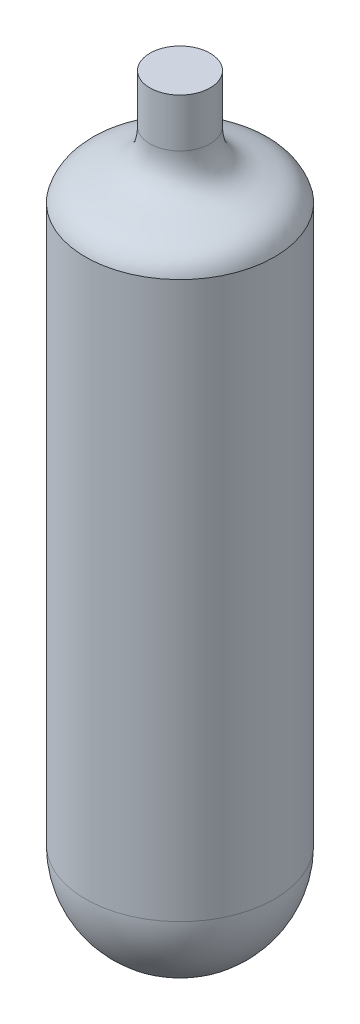
ISO-10303-21;
HEADER;
FILE_DESCRIPTION(('STEP AP214'),'2;1');
FILE_NAME('part.step','',(''),(''),'','','');
FILE_SCHEMA(('AUTOMOTIVE_DESIGN { 1 0 10303 214 1 1 1 1 }'));
ENDSEC;
DATA;
#1=APPLICATION_CONTEXT('core data for automotive mechanical design processes');
#2=APPLICATION_PROTOCOL_DEFINITION('international standard','automotive_design',2000,#1);
#3=PRODUCT_CONTEXT('',#1,'mechanical');
#4=PRODUCT('Part','Part','',(#3));
#5=PRODUCT_RELATED_PRODUCT_CATEGORY('part','',(#4));
#6=PRODUCT_DEFINITION_FORMATION('','',#4);
#7=PRODUCT_DEFINITION_CONTEXT('part definition',#1,'design');
#8=PRODUCT_DEFINITION('design','',#6,#7);
#9=PRODUCT_DEFINITION_SHAPE('','',#8);
#10=(LENGTH_UNIT() NAMED_UNIT(*) SI_UNIT(.MILLI.,.METRE.));
#11=(NAMED_UNIT(*) PLANE_ANGLE_UNIT() SI_UNIT($,.RADIAN.));
#12=(NAMED_UNIT(*) SI_UNIT($,.STERADIAN.) SOLID_ANGLE_UNIT());
#13=UNCERTAINTY_MEASURE_WITH_UNIT(LENGTH_MEASURE(1.E-05),#10,'distance_accuracy_value','');
#14=(GEOMETRIC_REPRESENTATION_CONTEXT(3) GLOBAL_UNCERTAINTY_ASSIGNED_CONTEXT((#13)) GLOBAL_UNIT_ASSIGNED_CONTEXT((#10,
#11,#12)) REPRESENTATION_CONTEXT('',''));
#15=CARTESIAN_POINT('',(0.,0.,0.));
#16=DIRECTION('',(0.,0.,1.));
#17=DIRECTION('',(1.,0.,0.));
#18=AXIS2_PLACEMENT_3D('',#15,#16,#17);
#19=CARTESIAN_POINT('',(3.49999999999999,44.3643877920503,0.));
#20=CARTESIAN_POINT('',(3.40191544216591,38.2169727225151,0.));
#21=CARTESIAN_POINT('',(9.7943354999844,41.0726981040417,0.));
#22=CARTESIAN_POINT('',(11.,36.7061899039137,0.));
#23=B_SPLINE_CURVE_WITH_KNOTS('',3,(#19,#20,#21,#22),.UNSPECIFIED.,.F.,.F.,(4,4),(0.,1.),.UNSPECIFIED.);
#24=CARTESIAN_POINT('',(0.,28.,0.));
#25=DIRECTION('',(0.,1.,0.));
#26=AXIS1_PLACEMENT('',#24,#25);
#27=SURFACE_OF_REVOLUTION('',#23,#26);
#28=CARTESIAN_POINT('',(0.,36.7061899039137,0.));
#29=DIRECTION('',(0.,1.,0.));
#30=DIRECTION('',(-1.,0.,0.));
#31=AXIS2_PLACEMENT_3D('',#28,#29,#30);
#32=CIRCLE('',#31,11.);
#33=CARTESIAN_POINT('',(-11.,36.7061899039137,0.));
#34=VERTEX_POINT('',#33);
#35=EDGE_CURVE('E53',#34,#34,#32,.T.);
#36=ORIENTED_EDGE('',*,*,#35,.T.);
#37=EDGE_LOOP('',(#36));
#38=FACE_BOUND('',#37,.T.);
#39=CARTESIAN_POINT('',(0.,44.3643877920503,0.));
#40=DIRECTION('',(0.,1.,0.));
#41=DIRECTION('',(-1.,0.,0.));
#42=AXIS2_PLACEMENT_3D('',#39,#40,#41);
#43=CIRCLE('',#42,3.49999999999999);
#44=CARTESIAN_POINT('',(-3.49999999999999,44.3643877920503,0.));
#45=VERTEX_POINT('',#44);
#46=EDGE_CURVE('E10',#45,#45,#43,.T.);
#47=ORIENTED_EDGE('',*,*,#46,.F.);
#48=EDGE_LOOP('',(#47));
#49=FACE_BOUND('',#48,.T.);
#50=ADVANCED_FACE('F38',(#38,#49),#27,.F.);
#51=CARTESIAN_POINT('',(0.,28.,0.));
#52=DIRECTION('',(0.,1.,0.));
#53=DIRECTION('',(-1.,0.,0.));
#54=AXIS2_PLACEMENT_3D('',#51,#52,#53);
#55=CYLINDRICAL_SURFACE('',#54,3.49999999999999);
#56=CARTESIAN_POINT('',(0.,50.,0.));
#57=DIRECTION('',(0.,1.,0.));
#58=DIRECTION('',(-1.,0.,0.));
#59=AXIS2_PLACEMENT_3D('',#56,#57,#58);
#60=CIRCLE('',#59,3.49999999999999);
#61=CARTESIAN_POINT('',(-3.49999999999999,50.,0.));
#62=VERTEX_POINT('',#61);
#63=EDGE_CURVE('E45',#62,#62,#60,.T.);
#64=ORIENTED_EDGE('',*,*,#63,.F.);
#65=EDGE_LOOP('',(#64));
#66=FACE_BOUND('',#65,.T.);
#67=ORIENTED_EDGE('',*,*,#46,.T.);
#68=EDGE_LOOP('',(#67));
#69=FACE_BOUND('',#68,.T.);
#70=ADVANCED_FACE('F79',(#66,#69),#55,.T.);
#71=CARTESIAN_POINT('',(2.97381167310311E-13,50.,0.));
#72=DIRECTION('',(0.,-1.,0.));
#73=DIRECTION('',(1.,0.,0.));
#74=AXIS2_PLACEMENT_3D('',#71,#72,#73);
#75=PLANE('',#74);
#76=ORIENTED_EDGE('',*,*,#63,.T.);
#77=EDGE_LOOP('',(#76));
#78=FACE_BOUND('',#77,.T.);
#79=ADVANCED_FACE('F75',(#78),#75,.F.);
#80=CARTESIAN_POINT('',(0.,-28.,0.));
#81=DIRECTION('',(0.,1.,0.));
#82=DIRECTION('',(-1.,0.,0.));
#83=AXIS2_PLACEMENT_3D('',#80,#81,#82);
#84=SPHERICAL_SURFACE('',#83,11.);
#85=CARTESIAN_POINT('',(0.,-28.,0.));
#86=DIRECTION('',(0.,1.,0.));
#87=DIRECTION('',(-1.,0.,0.));
#88=AXIS2_PLACEMENT_3D('',#85,#86,#87);
#89=CIRCLE('',#88,11.);
#90=CARTESIAN_POINT('',(-11.,-28.,0.));
#91=VERTEX_POINT('',#90);
#92=EDGE_CURVE('E49',#91,#91,#89,.T.);
#93=ORIENTED_EDGE('',*,*,#92,.F.);
#94=EDGE_LOOP('',(#93));
#95=FACE_BOUND('',#94,.T.);
#96=ADVANCED_FACE('F69',(#95),#84,.T.);
#97=CARTESIAN_POINT('',(0.,28.,0.));
#98=DIRECTION('',(0.,1.,0.));
#99=DIRECTION('',(-1.,0.,0.));
#100=AXIS2_PLACEMENT_3D('',#97,#98,#99);
#101=CYLINDRICAL_SURFACE('',#100,11.);
#102=ORIENTED_EDGE('',*,*,#92,.T.);
#103=EDGE_LOOP('',(#102));
#104=FACE_BOUND('',#103,.T.);
#105=ORIENTED_EDGE('',*,*,#35,.F.);
#106=EDGE_LOOP('',(#105));
#107=FACE_BOUND('',#106,.T.);
#108=ADVANCED_FACE('F67',(#104,#107),#101,.T.);
#109=CLOSED_SHELL('',(#50,#70,#79,#96,#108));
#110=MANIFOLD_SOLID_BREP('B2',#109);
#111=ADVANCED_BREP_SHAPE_REPRESENTATION('',(#18,#110),#14);
#112=SHAPE_DEFINITION_REPRESENTATION(#9,#111);
ENDSEC;
END-ISO-10303-21;
